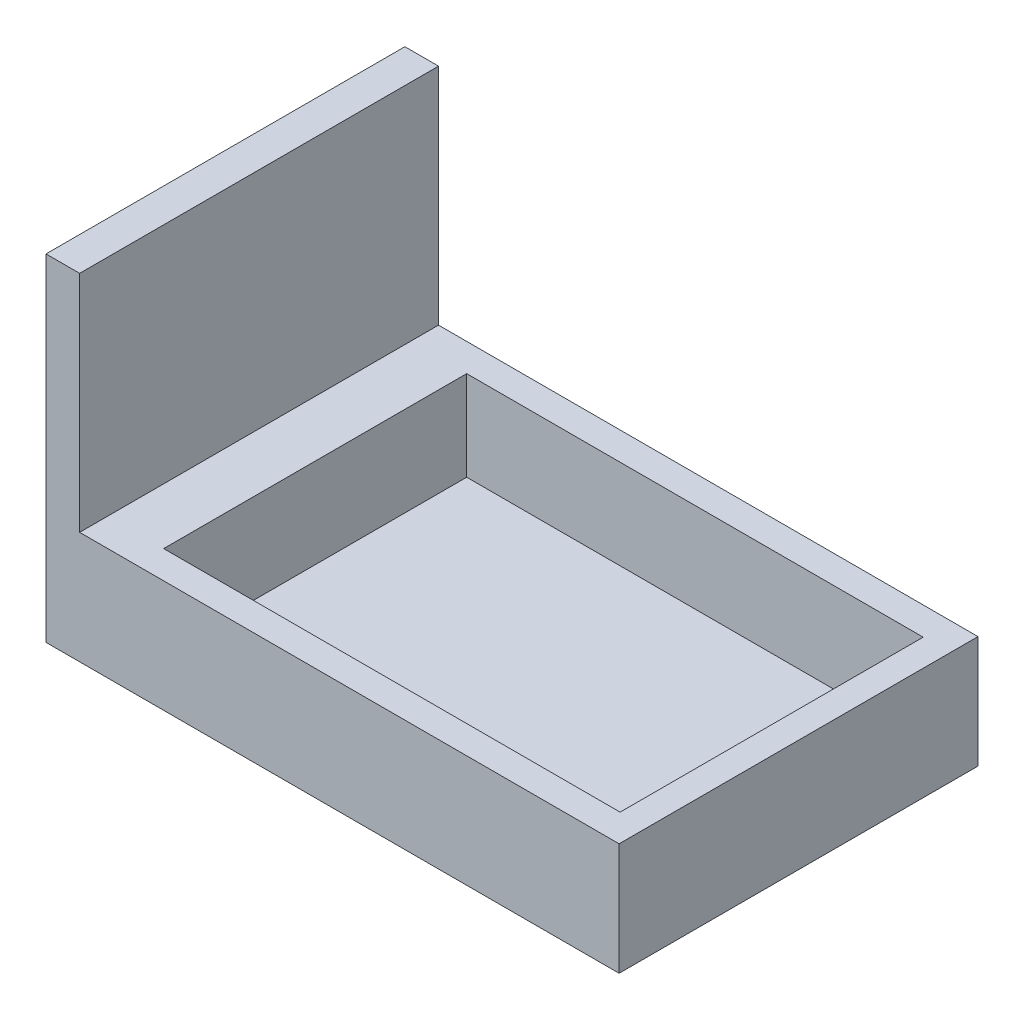
ISO-10303-21;
HEADER;
FILE_DESCRIPTION(('STEP AP214'),'2;1');
FILE_NAME('part.step','',(''),(''),'','','');
FILE_SCHEMA(('AUTOMOTIVE_DESIGN { 1 0 10303 214 1 1 1 1 }'));
ENDSEC;
DATA;
#1=APPLICATION_CONTEXT('core data for automotive mechanical design processes');
#2=APPLICATION_PROTOCOL_DEFINITION('international standard','automotive_design',2000,#1);
#3=PRODUCT_CONTEXT('',#1,'mechanical');
#4=PRODUCT('Part','Part','',(#3));
#5=PRODUCT_RELATED_PRODUCT_CATEGORY('part','',(#4));
#6=PRODUCT_DEFINITION_FORMATION('','',#4);
#7=PRODUCT_DEFINITION_CONTEXT('part definition',#1,'design');
#8=PRODUCT_DEFINITION('design','',#6,#7);
#9=PRODUCT_DEFINITION_SHAPE('','',#8);
#10=(LENGTH_UNIT() NAMED_UNIT(*) SI_UNIT(.MILLI.,.METRE.));
#11=(NAMED_UNIT(*) PLANE_ANGLE_UNIT() SI_UNIT($,.RADIAN.));
#12=(NAMED_UNIT(*) SI_UNIT($,.STERADIAN.) SOLID_ANGLE_UNIT());
#13=UNCERTAINTY_MEASURE_WITH_UNIT(LENGTH_MEASURE(1.E-05),#10,'distance_accuracy_value','');
#14=(GEOMETRIC_REPRESENTATION_CONTEXT(3) GLOBAL_UNCERTAINTY_ASSIGNED_CONTEXT((#13)) GLOBAL_UNIT_ASSIGNED_CONTEXT((#10,
#11,#12)) REPRESENTATION_CONTEXT('',''));
#15=CARTESIAN_POINT('',(0.,0.,0.));
#16=DIRECTION('',(0.,0.,1.));
#17=DIRECTION('',(1.,0.,0.));
#18=AXIS2_PLACEMENT_3D('',#15,#16,#17);
#19=CARTESIAN_POINT('',(0.,10.,0.));
#20=DIRECTION('',(0.,0.,-1.));
#21=DIRECTION('',(-1.,0.,0.));
#22=AXIS2_PLACEMENT_3D('',#19,#20,#21);
#23=PLANE('',#22);
#24=DIRECTION('',(1.,0.,0.));
#25=VECTOR('',#24,1.);
#26=CARTESIAN_POINT('',(0.,0.,0.));
#27=LINE('',#26,#25);
#28=CARTESIAN_POINT('',(-5.6,0.,0.));
#29=VERTEX_POINT('',#28);
#30=CARTESIAN_POINT('',(45.5,0.,0.));
#31=VERTEX_POINT('',#30);
#32=EDGE_CURVE('E168',#29,#31,#27,.T.);
#33=ORIENTED_EDGE('',*,*,#32,.T.);
#34=DIRECTION('',(0.,-1.,0.));
#35=VECTOR('',#34,1.);
#36=CARTESIAN_POINT('',(45.5,10.,0.));
#37=LINE('',#36,#35);
#38=CARTESIAN_POINT('',(45.5,10.,0.));
#39=VERTEX_POINT('',#38);
#40=EDGE_CURVE('E11',#39,#31,#37,.T.);
#41=ORIENTED_EDGE('',*,*,#40,.F.);
#42=DIRECTION('',(1.,0.,0.));
#43=VECTOR('',#42,1.);
#44=CARTESIAN_POINT('',(0.,10.,0.));
#45=LINE('',#44,#43);
#46=CARTESIAN_POINT('',(-2.6,10.,0.));
#47=VERTEX_POINT('',#46);
#48=EDGE_CURVE('E174',#47,#39,#45,.T.);
#49=ORIENTED_EDGE('',*,*,#48,.F.);
#50=DIRECTION('',(0.,-1.,0.));
#51=VECTOR('',#50,1.);
#52=CARTESIAN_POINT('',(-2.6,30.,0.));
#53=LINE('',#52,#51);
#54=CARTESIAN_POINT('',(-2.6,30.,0.));
#55=VERTEX_POINT('',#54);
#56=EDGE_CURVE('E132',#55,#47,#53,.T.);
#57=ORIENTED_EDGE('',*,*,#56,.F.);
#58=DIRECTION('',(1.,0.,0.));
#59=VECTOR('',#58,1.);
#60=CARTESIAN_POINT('',(-5.6,30.,0.));
#61=LINE('',#60,#59);
#62=CARTESIAN_POINT('',(-5.6,30.,0.));
#63=VERTEX_POINT('',#62);
#64=EDGE_CURVE('E126',#63,#55,#61,.T.);
#65=ORIENTED_EDGE('',*,*,#64,.F.);
#66=DIRECTION('',(0.,1.,0.));
#67=VECTOR('',#66,1.);
#68=CARTESIAN_POINT('',(-5.6,0.,0.));
#69=LINE('',#68,#67);
#70=EDGE_CURVE('E141',#29,#63,#69,.T.);
#71=ORIENTED_EDGE('',*,*,#70,.F.);
#72=EDGE_LOOP('',(#33,#41,#49,#57,#65,#71));
#73=FACE_BOUND('',#72,.T.);
#74=ADVANCED_FACE('F33',(#73),#23,.F.);
#75=CARTESIAN_POINT('',(45.5,10.,0.));
#76=DIRECTION('',(-1.,0.,0.));
#77=DIRECTION('',(0.,0.,1.));
#78=AXIS2_PLACEMENT_3D('',#75,#76,#77);
#79=PLANE('',#78);
#80=DIRECTION('',(0.,0.,-1.));
#81=VECTOR('',#80,1.);
#82=CARTESIAN_POINT('',(45.5,0.,0.));
#83=LINE('',#82,#81);
#84=CARTESIAN_POINT('',(45.5,0.,-32.));
#85=VERTEX_POINT('',#84);
#86=EDGE_CURVE('E182',#31,#85,#83,.T.);
#87=ORIENTED_EDGE('',*,*,#86,.T.);
#88=DIRECTION('',(0.,-1.,0.));
#89=VECTOR('',#88,1.);
#90=CARTESIAN_POINT('',(45.5,10.,-32.));
#91=LINE('',#90,#89);
#92=CARTESIAN_POINT('',(45.5,10.,-32.));
#93=VERTEX_POINT('',#92);
#94=EDGE_CURVE('E40',#93,#85,#91,.T.);
#95=ORIENTED_EDGE('',*,*,#94,.F.);
#96=DIRECTION('',(0.,0.,-1.));
#97=VECTOR('',#96,1.);
#98=CARTESIAN_POINT('',(45.5,10.,0.));
#99=LINE('',#98,#97);
#100=EDGE_CURVE('E176',#39,#93,#99,.T.);
#101=ORIENTED_EDGE('',*,*,#100,.F.);
#102=ORIENTED_EDGE('',*,*,#40,.T.);
#103=EDGE_LOOP('',(#87,#95,#101,#102));
#104=FACE_BOUND('',#103,.T.);
#105=ADVANCED_FACE('F202',(#104),#79,.F.);
#106=CARTESIAN_POINT('',(45.5,10.,-32.));
#107=DIRECTION('',(0.,0.,1.));
#108=DIRECTION('',(1.,0.,0.));
#109=AXIS2_PLACEMENT_3D('',#106,#107,#108);
#110=PLANE('',#109);
#111=DIRECTION('',(-1.,0.,0.));
#112=VECTOR('',#111,1.);
#113=CARTESIAN_POINT('',(45.5,0.,-32.));
#114=LINE('',#113,#112);
#115=CARTESIAN_POINT('',(-5.6,0.,-32.));
#116=VERTEX_POINT('',#115);
#117=EDGE_CURVE('E177',#85,#116,#114,.T.);
#118=ORIENTED_EDGE('',*,*,#117,.T.);
#119=DIRECTION('',(0.,-1.,0.));
#120=VECTOR('',#119,1.);
#121=CARTESIAN_POINT('',(-5.6,10.,-32.));
#122=LINE('',#121,#120);
#123=CARTESIAN_POINT('',(-5.6,30.,-32.));
#124=VERTEX_POINT('',#123);
#125=EDGE_CURVE('E116',#124,#116,#122,.T.);
#126=ORIENTED_EDGE('',*,*,#125,.F.);
#127=DIRECTION('',(-1.,0.,0.));
#128=VECTOR('',#127,1.);
#129=CARTESIAN_POINT('',(-2.6,30.,-32.));
#130=LINE('',#129,#128);
#131=CARTESIAN_POINT('',(-2.6,30.,-32.));
#132=VERTEX_POINT('',#131);
#133=EDGE_CURVE('E109',#132,#124,#130,.T.);
#134=ORIENTED_EDGE('',*,*,#133,.F.);
#135=DIRECTION('',(0.,-1.,0.));
#136=VECTOR('',#135,1.);
#137=CARTESIAN_POINT('',(-2.6,30.,-32.));
#138=LINE('',#137,#136);
#139=CARTESIAN_POINT('',(-2.6,10.,-32.));
#140=VERTEX_POINT('',#139);
#141=EDGE_CURVE('E114',#132,#140,#138,.T.);
#142=ORIENTED_EDGE('',*,*,#141,.T.);
#143=DIRECTION('',(-1.,0.,0.));
#144=VECTOR('',#143,1.);
#145=CARTESIAN_POINT('',(45.5,10.,-32.));
#146=LINE('',#145,#144);
#147=EDGE_CURVE('E179',#93,#140,#146,.T.);
#148=ORIENTED_EDGE('',*,*,#147,.F.);
#149=ORIENTED_EDGE('',*,*,#94,.T.);
#150=EDGE_LOOP('',(#118,#126,#134,#142,#148,#149));
#151=FACE_BOUND('',#150,.T.);
#152=ADVANCED_FACE('F111',(#151),#110,.F.);
#153=CARTESIAN_POINT('',(0.,10.,0.));
#154=DIRECTION('',(0.,1.,0.));
#155=DIRECTION('',(0.,0.,1.));
#156=AXIS2_PLACEMENT_3D('',#153,#154,#155);
#157=PLANE('',#156);
#158=DIRECTION('',(0.,0.,-1.));
#159=VECTOR('',#158,1.);
#160=CARTESIAN_POINT('',(-2.6,10.,0.));
#161=LINE('',#160,#159);
#162=EDGE_CURVE('E47',#47,#140,#161,.T.);
#163=ORIENTED_EDGE('',*,*,#162,.F.);
#164=ORIENTED_EDGE('',*,*,#48,.T.);
#165=ORIENTED_EDGE('',*,*,#100,.T.);
#166=ORIENTED_EDGE('',*,*,#147,.T.);
#167=EDGE_LOOP('',(#163,#164,#165,#166));
#168=FACE_BOUND('',#167,.T.);
#169=DIRECTION('',(0.,0.,1.));
#170=VECTOR('',#169,1.);
#171=CARTESIAN_POINT('',(2.39999303832947,10.,0.));
#172=LINE('',#171,#170);
#173=CARTESIAN_POINT('',(2.39999303832947,10.,-29.5100247477257));
#174=VERTEX_POINT('',#173);
#175=CARTESIAN_POINT('',(2.39999303832947,10.,-2.49002474772568));
#176=VERTEX_POINT('',#175);
#177=EDGE_CURVE('E55',#174,#176,#172,.T.);
#178=ORIENTED_EDGE('',*,*,#177,.F.);
#179=DIRECTION('',(-1.,0.,0.));
#180=VECTOR('',#179,1.);
#181=CARTESIAN_POINT('',(0.,10.,-29.5100247477257));
#182=LINE('',#181,#180);
#183=CARTESIAN_POINT('',(43.0999930383295,10.,-29.5100247477257));
#184=VERTEX_POINT('',#183);
#185=EDGE_CURVE('E147',#184,#174,#182,.T.);
#186=ORIENTED_EDGE('',*,*,#185,.F.);
#187=DIRECTION('',(0.,0.,-1.));
#188=VECTOR('',#187,1.);
#189=CARTESIAN_POINT('',(43.0999930383295,10.,0.));
#190=LINE('',#189,#188);
#191=CARTESIAN_POINT('',(43.0999930383295,10.,-2.49002474772568));
#192=VERTEX_POINT('',#191);
#193=EDGE_CURVE('E161',#192,#184,#190,.T.);
#194=ORIENTED_EDGE('',*,*,#193,.F.);
#195=DIRECTION('',(1.,0.,0.));
#196=VECTOR('',#195,1.);
#197=CARTESIAN_POINT('',(0.,10.,-2.49002474772568));
#198=LINE('',#197,#196);
#199=EDGE_CURVE('E158',#176,#192,#198,.T.);
#200=ORIENTED_EDGE('',*,*,#199,.F.);
#201=EDGE_LOOP('',(#178,#186,#194,#200));
#202=FACE_BOUND('',#201,.T.);
#203=ADVANCED_FACE('F200',(#168,#202),#157,.T.);
#204=CARTESIAN_POINT('',(0.,0.,0.));
#205=DIRECTION('',(0.,1.,0.));
#206=DIRECTION('',(0.,0.,1.));
#207=AXIS2_PLACEMENT_3D('',#204,#205,#206);
#208=PLANE('',#207);
#209=ORIENTED_EDGE('',*,*,#32,.F.);
#210=DIRECTION('',(0.,0.,1.));
#211=VECTOR('',#210,1.);
#212=CARTESIAN_POINT('',(-5.6,0.,-32.));
#213=LINE('',#212,#211);
#214=EDGE_CURVE('E134',#116,#29,#213,.T.);
#215=ORIENTED_EDGE('',*,*,#214,.F.);
#216=ORIENTED_EDGE('',*,*,#117,.F.);
#217=ORIENTED_EDGE('',*,*,#86,.F.);
#218=EDGE_LOOP('',(#209,#215,#216,#217));
#219=FACE_BOUND('',#218,.T.);
#220=ADVANCED_FACE('F192',(#219),#208,.F.);
#221=CARTESIAN_POINT('',(2.39999303832947,2.,0.));
#222=DIRECTION('',(-1.,0.,0.));
#223=DIRECTION('',(0.,0.,1.));
#224=AXIS2_PLACEMENT_3D('',#221,#222,#223);
#225=PLANE('',#224);
#226=ORIENTED_EDGE('',*,*,#177,.T.);
#227=DIRECTION('',(0.,1.,0.));
#228=VECTOR('',#227,1.);
#229=CARTESIAN_POINT('',(2.39999303832947,2.,-2.49002474772568));
#230=LINE('',#229,#228);
#231=CARTESIAN_POINT('',(2.39999303832947,2.,-2.49002474772568));
#232=VERTEX_POINT('',#231);
#233=EDGE_CURVE('E156',#232,#176,#230,.T.);
#234=ORIENTED_EDGE('',*,*,#233,.F.);
#235=DIRECTION('',(0.,0.,1.));
#236=VECTOR('',#235,1.);
#237=CARTESIAN_POINT('',(2.39999303832947,2.,0.));
#238=LINE('',#237,#236);
#239=CARTESIAN_POINT('',(2.39999303832947,2.,-29.5100247477257));
#240=VERTEX_POINT('',#239);
#241=EDGE_CURVE('E143',#240,#232,#238,.T.);
#242=ORIENTED_EDGE('',*,*,#241,.F.);
#243=DIRECTION('',(0.,1.,0.));
#244=VECTOR('',#243,1.);
#245=CARTESIAN_POINT('',(2.39999303832947,2.,-29.5100247477257));
#246=LINE('',#245,#244);
#247=EDGE_CURVE('E166',#240,#174,#246,.T.);
#248=ORIENTED_EDGE('',*,*,#247,.T.);
#249=EDGE_LOOP('',(#226,#234,#242,#248));
#250=FACE_BOUND('',#249,.T.);
#251=ADVANCED_FACE('F212',(#250),#225,.F.);
#252=CARTESIAN_POINT('',(0.,2.,-29.5100247477257));
#253=DIRECTION('',(0.,0.,-1.));
#254=DIRECTION('',(-1.,0.,0.));
#255=AXIS2_PLACEMENT_3D('',#252,#253,#254);
#256=PLANE('',#255);
#257=ORIENTED_EDGE('',*,*,#185,.T.);
#258=ORIENTED_EDGE('',*,*,#247,.F.);
#259=DIRECTION('',(-1.,0.,0.));
#260=VECTOR('',#259,1.);
#261=CARTESIAN_POINT('',(0.,2.,-29.5100247477257));
#262=LINE('',#261,#260);
#263=CARTESIAN_POINT('',(43.0999930383295,2.,-29.5100247477257));
#264=VERTEX_POINT('',#263);
#265=EDGE_CURVE('E153',#264,#240,#262,.T.);
#266=ORIENTED_EDGE('',*,*,#265,.F.);
#267=DIRECTION('',(0.,1.,0.));
#268=VECTOR('',#267,1.);
#269=CARTESIAN_POINT('',(43.0999930383295,2.,-29.5100247477257));
#270=LINE('',#269,#268);
#271=EDGE_CURVE('E169',#264,#184,#270,.T.);
#272=ORIENTED_EDGE('',*,*,#271,.T.);
#273=EDGE_LOOP('',(#257,#258,#266,#272));
#274=FACE_BOUND('',#273,.T.);
#275=ADVANCED_FACE('F217',(#274),#256,.F.);
#276=CARTESIAN_POINT('',(43.0999930383295,2.,0.));
#277=DIRECTION('',(1.,0.,0.));
#278=DIRECTION('',(0.,0.,-1.));
#279=AXIS2_PLACEMENT_3D('',#276,#277,#278);
#280=PLANE('',#279);
#281=ORIENTED_EDGE('',*,*,#193,.T.);
#282=ORIENTED_EDGE('',*,*,#271,.F.);
#283=DIRECTION('',(0.,0.,-1.));
#284=VECTOR('',#283,1.);
#285=CARTESIAN_POINT('',(43.0999930383295,2.,0.));
#286=LINE('',#285,#284);
#287=CARTESIAN_POINT('',(43.0999930383295,2.,-2.49002474772568));
#288=VERTEX_POINT('',#287);
#289=EDGE_CURVE('E150',#288,#264,#286,.T.);
#290=ORIENTED_EDGE('',*,*,#289,.F.);
#291=DIRECTION('',(0.,1.,0.));
#292=VECTOR('',#291,1.);
#293=CARTESIAN_POINT('',(43.0999930383295,2.,-2.49002474772568));
#294=LINE('',#293,#292);
#295=EDGE_CURVE('E171',#288,#192,#294,.T.);
#296=ORIENTED_EDGE('',*,*,#295,.T.);
#297=EDGE_LOOP('',(#281,#282,#290,#296));
#298=FACE_BOUND('',#297,.T.);
#299=ADVANCED_FACE('F222',(#298),#280,.F.);
#300=CARTESIAN_POINT('',(0.,2.,-2.49002474772568));
#301=DIRECTION('',(0.,0.,1.));
#302=DIRECTION('',(1.,0.,0.));
#303=AXIS2_PLACEMENT_3D('',#300,#301,#302);
#304=PLANE('',#303);
#305=ORIENTED_EDGE('',*,*,#199,.T.);
#306=ORIENTED_EDGE('',*,*,#295,.F.);
#307=DIRECTION('',(1.,0.,0.));
#308=VECTOR('',#307,1.);
#309=CARTESIAN_POINT('',(0.,2.,-2.49002474772568));
#310=LINE('',#309,#308);
#311=EDGE_CURVE('E146',#232,#288,#310,.T.);
#312=ORIENTED_EDGE('',*,*,#311,.F.);
#313=ORIENTED_EDGE('',*,*,#233,.T.);
#314=EDGE_LOOP('',(#305,#306,#312,#313));
#315=FACE_BOUND('',#314,.T.);
#316=ADVANCED_FACE('F218',(#315),#304,.F.);
#317=CARTESIAN_POINT('',(0.,2.,0.));
#318=DIRECTION('',(0.,1.,0.));
#319=DIRECTION('',(0.,0.,1.));
#320=AXIS2_PLACEMENT_3D('',#317,#318,#319);
#321=PLANE('',#320);
#322=ORIENTED_EDGE('',*,*,#241,.T.);
#323=ORIENTED_EDGE('',*,*,#311,.T.);
#324=ORIENTED_EDGE('',*,*,#289,.T.);
#325=ORIENTED_EDGE('',*,*,#265,.T.);
#326=EDGE_LOOP('',(#322,#323,#324,#325));
#327=FACE_BOUND('',#326,.T.);
#328=ADVANCED_FACE('F221',(#327),#321,.T.);
#329=CARTESIAN_POINT('',(-5.6,0.,0.));
#330=DIRECTION('',(-1.,0.,0.));
#331=DIRECTION('',(0.,0.,1.));
#332=AXIS2_PLACEMENT_3D('',#329,#330,#331);
#333=PLANE('',#332);
#334=ORIENTED_EDGE('',*,*,#70,.T.);
#335=DIRECTION('',(0.,0.,1.));
#336=VECTOR('',#335,1.);
#337=CARTESIAN_POINT('',(-5.6,30.,-32.));
#338=LINE('',#337,#336);
#339=EDGE_CURVE('E120',#124,#63,#338,.T.);
#340=ORIENTED_EDGE('',*,*,#339,.F.);
#341=ORIENTED_EDGE('',*,*,#125,.T.);
#342=ORIENTED_EDGE('',*,*,#214,.T.);
#343=EDGE_LOOP('',(#334,#340,#341,#342));
#344=FACE_BOUND('',#343,.T.);
#345=ADVANCED_FACE('F195',(#344),#333,.T.);
#346=CARTESIAN_POINT('',(-2.6,30.,0.));
#347=DIRECTION('',(-1.,0.,0.));
#348=DIRECTION('',(0.,0.,1.));
#349=AXIS2_PLACEMENT_3D('',#346,#347,#348);
#350=PLANE('',#349);
#351=ORIENTED_EDGE('',*,*,#162,.T.);
#352=ORIENTED_EDGE('',*,*,#141,.F.);
#353=DIRECTION('',(0.,0.,-1.));
#354=VECTOR('',#353,1.);
#355=CARTESIAN_POINT('',(-2.6,30.,0.));
#356=LINE('',#355,#354);
#357=EDGE_CURVE('E121',#55,#132,#356,.T.);
#358=ORIENTED_EDGE('',*,*,#357,.F.);
#359=ORIENTED_EDGE('',*,*,#56,.T.);
#360=EDGE_LOOP('',(#351,#352,#358,#359));
#361=FACE_BOUND('',#360,.T.);
#362=ADVANCED_FACE('F131',(#361),#350,.F.);
#363=CARTESIAN_POINT('',(0.,30.,0.));
#364=DIRECTION('',(0.,1.,0.));
#365=DIRECTION('',(0.,0.,1.));
#366=AXIS2_PLACEMENT_3D('',#363,#364,#365);
#367=PLANE('',#366);
#368=ORIENTED_EDGE('',*,*,#357,.T.);
#369=ORIENTED_EDGE('',*,*,#133,.T.);
#370=ORIENTED_EDGE('',*,*,#339,.T.);
#371=ORIENTED_EDGE('',*,*,#64,.T.);
#372=EDGE_LOOP('',(#368,#369,#370,#371));
#373=FACE_BOUND('',#372,.T.);
#374=ADVANCED_FACE('F124',(#373),#367,.T.);
#375=CLOSED_SHELL('',(#74,#105,#152,#203,#220,#251,#275,#299,#316,#328,#345,#362,#374));
#376=MANIFOLD_SOLID_BREP('B2',#375);
#377=ADVANCED_BREP_SHAPE_REPRESENTATION('',(#18,#376),#14);
#378=SHAPE_DEFINITION_REPRESENTATION(#9,#377);
ENDSEC;
END-ISO-10303-21;
